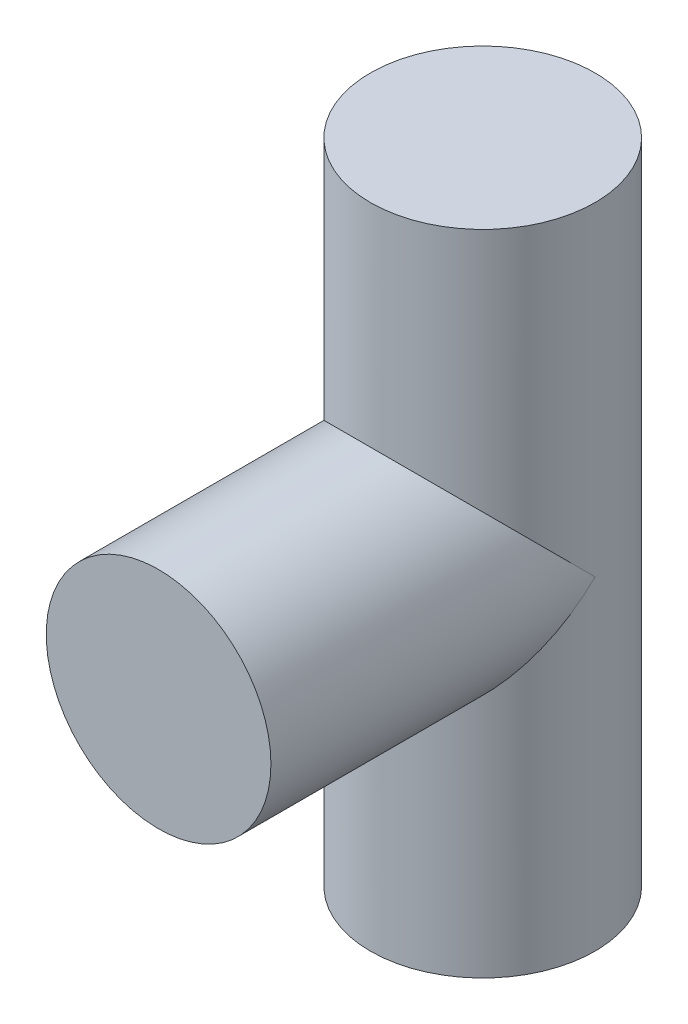
ISO-10303-21;
HEADER;
FILE_DESCRIPTION(('STEP AP214'),'2;1');
FILE_NAME('part.step','',(''),(''),'','','');
FILE_SCHEMA(('AUTOMOTIVE_DESIGN { 1 0 10303 214 1 1 1 1 }'));
ENDSEC;
DATA;
#1=APPLICATION_CONTEXT('core data for automotive mechanical design processes');
#2=APPLICATION_PROTOCOL_DEFINITION('international standard','automotive_design',2000,#1);
#3=PRODUCT_CONTEXT('',#1,'mechanical');
#4=PRODUCT('Part','Part','',(#3));
#5=PRODUCT_RELATED_PRODUCT_CATEGORY('part','',(#4));
#6=PRODUCT_DEFINITION_FORMATION('','',#4);
#7=PRODUCT_DEFINITION_CONTEXT('part definition',#1,'design');
#8=PRODUCT_DEFINITION('design','',#6,#7);
#9=PRODUCT_DEFINITION_SHAPE('','',#8);
#10=(LENGTH_UNIT() NAMED_UNIT(*) SI_UNIT(.MILLI.,.METRE.));
#11=(NAMED_UNIT(*) PLANE_ANGLE_UNIT() SI_UNIT($,.RADIAN.));
#12=(NAMED_UNIT(*) SI_UNIT($,.STERADIAN.) SOLID_ANGLE_UNIT());
#13=UNCERTAINTY_MEASURE_WITH_UNIT(LENGTH_MEASURE(1.E-05),#10,'distance_accuracy_value','');
#14=(GEOMETRIC_REPRESENTATION_CONTEXT(3) GLOBAL_UNCERTAINTY_ASSIGNED_CONTEXT((#13)) GLOBAL_UNIT_ASSIGNED_CONTEXT((#10,
#11,#12)) REPRESENTATION_CONTEXT('',''));
#15=CARTESIAN_POINT('',(0.,0.,0.));
#16=DIRECTION('',(0.,0.,1.));
#17=DIRECTION('',(1.,0.,0.));
#18=AXIS2_PLACEMENT_3D('',#15,#16,#17);
#19=CARTESIAN_POINT('',(0.,-36.068,0.));
#20=DIRECTION('',(0.,1.,0.));
#21=DIRECTION('',(0.,0.,1.));
#22=AXIS2_PLACEMENT_3D('',#19,#20,#21);
#23=CYLINDRICAL_SURFACE('',#22,12.5);
#24=CARTESIAN_POINT('',(0.,36.068,0.));
#25=DIRECTION('',(0.,1.,0.));
#26=DIRECTION('',(0.,0.,1.));
#27=AXIS2_PLACEMENT_3D('',#24,#25,#26);
#28=CIRCLE('',#27,12.5);
#29=CARTESIAN_POINT('',(0.,36.068,12.5));
#30=VERTEX_POINT('',#29);
#31=EDGE_CURVE('E59',#30,#30,#28,.T.);
#32=ORIENTED_EDGE('',*,*,#31,.F.);
#33=EDGE_LOOP('',(#32));
#34=FACE_BOUND('',#33,.T.);
#35=CARTESIAN_POINT('',(0.,-36.068,0.));
#36=DIRECTION('',(0.,1.,0.));
#37=DIRECTION('',(0.,0.,1.));
#38=AXIS2_PLACEMENT_3D('',#35,#36,#37);
#39=CIRCLE('',#38,12.5);
#40=CARTESIAN_POINT('',(0.,-36.068,12.5));
#41=VERTEX_POINT('',#40);
#42=EDGE_CURVE('E47',#41,#41,#39,.T.);
#43=ORIENTED_EDGE('',*,*,#42,.T.);
#44=EDGE_LOOP('',(#43));
#45=FACE_BOUND('',#44,.T.);
#46=CARTESIAN_POINT('',(0.,0.,0.));
#47=DIRECTION('',(0.,0.707106781186547,0.707106781186547));
#48=DIRECTION('',(0.,0.707106781186547,-0.707106781186547));
#49=AXIS2_PLACEMENT_3D('',#46,#47,#48);
#50=ELLIPSE('',#49,17.6776695296637,12.5);
#51=CARTESIAN_POINT('',(12.5,0.,0.));
#52=VERTEX_POINT('',#51);
#53=CARTESIAN_POINT('',(-12.5,0.,0.));
#54=VERTEX_POINT('',#53);
#55=EDGE_CURVE('E38',#52,#54,#50,.F.);
#56=ORIENTED_EDGE('',*,*,#55,.T.);
#57=CARTESIAN_POINT('',(0.,0.,0.));
#58=DIRECTION('',(0.,0.707106781186547,-0.707106781186547));
#59=DIRECTION('',(0.,0.707106781186547,0.707106781186547));
#60=AXIS2_PLACEMENT_3D('',#57,#58,#59);
#61=ELLIPSE('',#60,17.6776695296637,12.5);
#62=EDGE_CURVE('E11',#54,#52,#61,.T.);
#63=ORIENTED_EDGE('',*,*,#62,.T.);
#64=EDGE_LOOP('',(#56,#63));
#65=FACE_BOUND('',#64,.T.);
#66=ADVANCED_FACE('F31',(#34,#45,#65),#23,.T.);
#67=CARTESIAN_POINT('',(0.,-36.068,0.));
#68=DIRECTION('',(0.,1.,0.));
#69=DIRECTION('',(0.,0.,1.));
#70=AXIS2_PLACEMENT_3D('',#67,#68,#69);
#71=PLANE('',#70);
#72=ORIENTED_EDGE('',*,*,#42,.F.);
#73=EDGE_LOOP('',(#72));
#74=FACE_BOUND('',#73,.T.);
#75=ADVANCED_FACE('F49',(#74),#71,.F.);
#76=CARTESIAN_POINT('',(0.,36.068,0.));
#77=DIRECTION('',(0.,1.,0.));
#78=DIRECTION('',(0.,0.,1.));
#79=AXIS2_PLACEMENT_3D('',#76,#77,#78);
#80=PLANE('',#79);
#81=ORIENTED_EDGE('',*,*,#31,.T.);
#82=EDGE_LOOP('',(#81));
#83=FACE_BOUND('',#82,.T.);
#84=ADVANCED_FACE('F54',(#83),#80,.T.);
#85=CARTESIAN_POINT('',(0.,0.,36.068));
#86=DIRECTION('',(0.,0.,-1.));
#87=DIRECTION('',(-1.,0.,0.));
#88=AXIS2_PLACEMENT_3D('',#85,#86,#87);
#89=CYLINDRICAL_SURFACE('',#88,12.5);
#90=ORIENTED_EDGE('',*,*,#62,.F.);
#91=ORIENTED_EDGE('',*,*,#55,.F.);
#92=EDGE_LOOP('',(#90,#91));
#93=FACE_BOUND('',#92,.T.);
#94=CARTESIAN_POINT('',(0.,0.,36.068));
#95=DIRECTION('',(0.,0.,1.));
#96=DIRECTION('',(1.,0.,0.));
#97=AXIS2_PLACEMENT_3D('',#94,#95,#96);
#98=CIRCLE('',#97,12.5);
#99=CARTESIAN_POINT('',(12.5,0.,36.068));
#100=VERTEX_POINT('',#99);
#101=EDGE_CURVE('E63',#100,#100,#98,.T.);
#102=ORIENTED_EDGE('',*,*,#101,.F.);
#103=EDGE_LOOP('',(#102));
#104=FACE_BOUND('',#103,.T.);
#105=ADVANCED_FACE('F44',(#93,#104),#89,.T.);
#106=CARTESIAN_POINT('',(0.,0.,36.068));
#107=DIRECTION('',(0.,0.,1.));
#108=DIRECTION('',(1.,0.,0.));
#109=AXIS2_PLACEMENT_3D('',#106,#107,#108);
#110=PLANE('',#109);
#111=ORIENTED_EDGE('',*,*,#101,.T.);
#112=EDGE_LOOP('',(#111));
#113=FACE_BOUND('',#112,.T.);
#114=ADVANCED_FACE('F69',(#113),#110,.T.);
#115=CLOSED_SHELL('',(#66,#75,#84,#105,#114));
#116=MANIFOLD_SOLID_BREP('B2',#115);
#117=ADVANCED_BREP_SHAPE_REPRESENTATION('',(#18,#116),#14);
#118=SHAPE_DEFINITION_REPRESENTATION(#9,#117);
ENDSEC;
END-ISO-10303-21;
